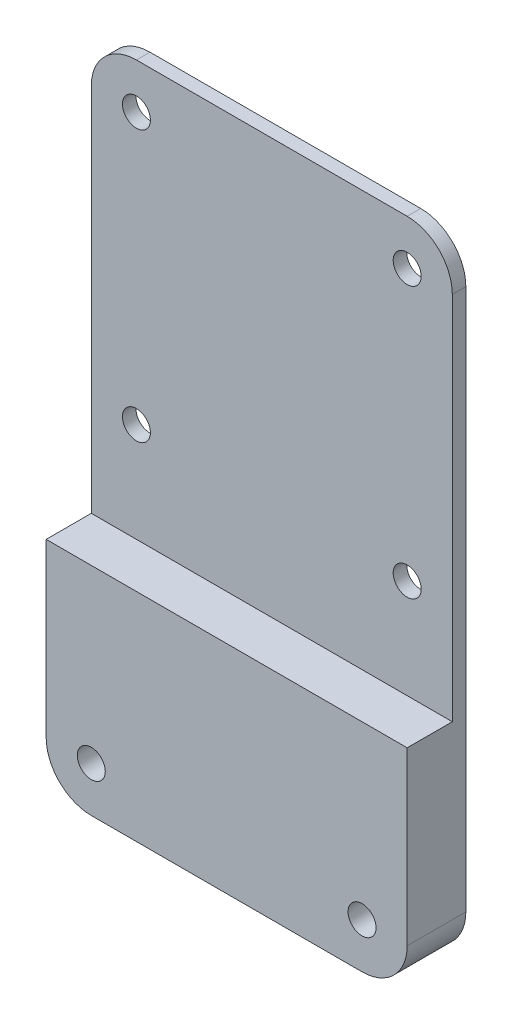
ISO-10303-21;
HEADER;
FILE_DESCRIPTION(('STEP AP214'),'2;1');
FILE_NAME('part.step','',(''),(''),'','','');
FILE_SCHEMA(('AUTOMOTIVE_DESIGN { 1 0 10303 214 1 1 1 1 }'));
ENDSEC;
DATA;
#1=APPLICATION_CONTEXT('core data for automotive mechanical design processes');
#2=APPLICATION_PROTOCOL_DEFINITION('international standard','automotive_design',2000,#1);
#3=PRODUCT_CONTEXT('',#1,'mechanical');
#4=PRODUCT('Part','Part','',(#3));
#5=PRODUCT_RELATED_PRODUCT_CATEGORY('part','',(#4));
#6=PRODUCT_DEFINITION_FORMATION('','',#4);
#7=PRODUCT_DEFINITION_CONTEXT('part definition',#1,'design');
#8=PRODUCT_DEFINITION('design','',#6,#7);
#9=PRODUCT_DEFINITION_SHAPE('','',#8);
#10=(LENGTH_UNIT() NAMED_UNIT(*) SI_UNIT(.MILLI.,.METRE.));
#11=(NAMED_UNIT(*) PLANE_ANGLE_UNIT() SI_UNIT($,.RADIAN.));
#12=(NAMED_UNIT(*) SI_UNIT($,.STERADIAN.) SOLID_ANGLE_UNIT());
#13=UNCERTAINTY_MEASURE_WITH_UNIT(LENGTH_MEASURE(1.E-05),#10,'distance_accuracy_value','');
#14=(GEOMETRIC_REPRESENTATION_CONTEXT(3) GLOBAL_UNCERTAINTY_ASSIGNED_CONTEXT((#13)) GLOBAL_UNIT_ASSIGNED_CONTEXT((#10,
#11,#12)) REPRESENTATION_CONTEXT('',''));
#15=CARTESIAN_POINT('',(0.,0.,0.));
#16=DIRECTION('',(0.,0.,1.));
#17=DIRECTION('',(1.,0.,0.));
#18=AXIS2_PLACEMENT_3D('',#15,#16,#17);
#19=CARTESIAN_POINT('',(0.,0.,1.5));
#20=DIRECTION('',(0.,0.,1.));
#21=DIRECTION('',(1.,0.,0.));
#22=AXIS2_PLACEMENT_3D('',#19,#20,#21);
#23=PLANE('',#22);
#24=DIRECTION('',(0.,1.,0.));
#25=VECTOR('',#24,1.);
#26=CARTESIAN_POINT('',(40.,0.,1.5));
#27=LINE('',#26,#25);
#28=CARTESIAN_POINT('',(40.,-46.,1.5));
#29=VERTEX_POINT('',#28);
#30=CARTESIAN_POINT('',(40.,-5.,1.5));
#31=VERTEX_POINT('',#30);
#32=EDGE_CURVE('E136',#29,#31,#27,.T.);
#33=ORIENTED_EDGE('',*,*,#32,.T.);
#34=CARTESIAN_POINT('',(35.,-5.,1.5));
#35=DIRECTION('',(0.,0.,1.));
#36=DIRECTION('',(1.,0.,0.));
#37=AXIS2_PLACEMENT_3D('',#34,#35,#36);
#38=CIRCLE('',#37,5.);
#39=CARTESIAN_POINT('',(35.,0.,1.5));
#40=VERTEX_POINT('',#39);
#41=EDGE_CURVE('E256',#31,#40,#38,.T.);
#42=ORIENTED_EDGE('',*,*,#41,.T.);
#43=DIRECTION('',(-1.,0.,0.));
#44=VECTOR('',#43,1.);
#45=CARTESIAN_POINT('',(0.,0.,1.5));
#46=LINE('',#45,#44);
#47=CARTESIAN_POINT('',(5.,0.,1.5));
#48=VERTEX_POINT('',#47);
#49=EDGE_CURVE('E210',#40,#48,#46,.T.);
#50=ORIENTED_EDGE('',*,*,#49,.T.);
#51=CARTESIAN_POINT('',(5.,-5.,1.5));
#52=DIRECTION('',(0.,0.,1.));
#53=DIRECTION('',(1.,0.,0.));
#54=AXIS2_PLACEMENT_3D('',#51,#52,#53);
#55=CIRCLE('',#54,5.);
#56=CARTESIAN_POINT('',(0.,-5.,1.5));
#57=VERTEX_POINT('',#56);
#58=EDGE_CURVE('E254',#48,#57,#55,.T.);
#59=ORIENTED_EDGE('',*,*,#58,.T.);
#60=DIRECTION('',(0.,-1.,0.));
#61=VECTOR('',#60,1.);
#62=CARTESIAN_POINT('',(0.,0.,1.5));
#63=LINE('',#62,#61);
#64=CARTESIAN_POINT('',(0.,-46.,1.5));
#65=VERTEX_POINT('',#64);
#66=EDGE_CURVE('E203',#57,#65,#63,.T.);
#67=ORIENTED_EDGE('',*,*,#66,.T.);
#68=DIRECTION('',(-1.,0.,0.));
#69=VECTOR('',#68,1.);
#70=CARTESIAN_POINT('',(0.,-46.,1.5));
#71=LINE('',#70,#69);
#72=EDGE_CURVE('E156',#29,#65,#71,.T.);
#73=ORIENTED_EDGE('',*,*,#72,.F.);
#74=EDGE_LOOP('',(#33,#42,#50,#59,#67,#73));
#75=FACE_BOUND('',#74,.T.);
#76=CARTESIAN_POINT('',(5.,-35.,1.5));
#77=DIRECTION('',(0.,0.,1.));
#78=DIRECTION('',(1.,0.,0.));
#79=AXIS2_PLACEMENT_3D('',#76,#77,#78);
#80=CIRCLE('',#79,1.55);
#81=CARTESIAN_POINT('',(6.55,-35.,1.5));
#82=VERTEX_POINT('',#81);
#83=EDGE_CURVE('E180',#82,#82,#80,.T.);
#84=ORIENTED_EDGE('',*,*,#83,.F.);
#85=EDGE_LOOP('',(#84));
#86=FACE_BOUND('',#85,.T.);
#87=CARTESIAN_POINT('',(5.,-5.,1.5));
#88=DIRECTION('',(0.,0.,1.));
#89=DIRECTION('',(1.,0.,0.));
#90=AXIS2_PLACEMENT_3D('',#87,#88,#89);
#91=CIRCLE('',#90,1.55);
#92=CARTESIAN_POINT('',(6.55,-5.,1.5));
#93=VERTEX_POINT('',#92);
#94=EDGE_CURVE('E193',#93,#93,#91,.T.);
#95=ORIENTED_EDGE('',*,*,#94,.F.);
#96=EDGE_LOOP('',(#95));
#97=FACE_BOUND('',#96,.T.);
#98=CARTESIAN_POINT('',(35.,-5.,1.5));
#99=DIRECTION('',(0.,0.,1.));
#100=DIRECTION('',(1.,0.,0.));
#101=AXIS2_PLACEMENT_3D('',#98,#99,#100);
#102=CIRCLE('',#101,1.54999999999999);
#103=CARTESIAN_POINT('',(36.55,-5.,1.5));
#104=VERTEX_POINT('',#103);
#105=EDGE_CURVE('E183',#104,#104,#102,.T.);
#106=ORIENTED_EDGE('',*,*,#105,.F.);
#107=EDGE_LOOP('',(#106));
#108=FACE_BOUND('',#107,.T.);
#109=CARTESIAN_POINT('',(35.,-35.,1.5));
#110=DIRECTION('',(0.,0.,1.));
#111=DIRECTION('',(1.,0.,0.));
#112=AXIS2_PLACEMENT_3D('',#109,#110,#111);
#113=CIRCLE('',#112,1.54999999999999);
#114=CARTESIAN_POINT('',(36.55,-35.,1.5));
#115=VERTEX_POINT('',#114);
#116=EDGE_CURVE('E166',#115,#115,#113,.T.);
#117=ORIENTED_EDGE('',*,*,#116,.F.);
#118=EDGE_LOOP('',(#117));
#119=FACE_BOUND('',#118,.T.);
#120=ADVANCED_FACE('F44',(#75,#86,#97,#108,#119),#23,.T.);
#121=CARTESIAN_POINT('',(0.,0.,0.));
#122=DIRECTION('',(0.,0.,1.));
#123=DIRECTION('',(1.,0.,0.));
#124=AXIS2_PLACEMENT_3D('',#121,#122,#123);
#125=PLANE('',#124);
#126=DIRECTION('',(-1.,0.,0.));
#127=VECTOR('',#126,1.);
#128=CARTESIAN_POINT('',(0.,0.,0.));
#129=LINE('',#128,#127);
#130=CARTESIAN_POINT('',(35.,0.,0.));
#131=VERTEX_POINT('',#130);
#132=CARTESIAN_POINT('',(5.,0.,0.));
#133=VERTEX_POINT('',#132);
#134=EDGE_CURVE('E204',#131,#133,#129,.T.);
#135=ORIENTED_EDGE('',*,*,#134,.F.);
#136=CARTESIAN_POINT('',(35.,-5.,0.));
#137=DIRECTION('',(0.,0.,1.));
#138=DIRECTION('',(1.,0.,0.));
#139=AXIS2_PLACEMENT_3D('',#136,#137,#138);
#140=CIRCLE('',#139,5.);
#141=CARTESIAN_POINT('',(40.,-5.,0.));
#142=VERTEX_POINT('',#141);
#143=EDGE_CURVE('E247',#131,#142,#140,.F.);
#144=ORIENTED_EDGE('',*,*,#143,.T.);
#145=DIRECTION('',(0.,1.,0.));
#146=VECTOR('',#145,1.);
#147=CARTESIAN_POINT('',(40.,0.,0.));
#148=LINE('',#147,#146);
#149=CARTESIAN_POINT('',(40.,-65.,0.));
#150=VERTEX_POINT('',#149);
#151=EDGE_CURVE('E217',#150,#142,#148,.T.);
#152=ORIENTED_EDGE('',*,*,#151,.F.);
#153=CARTESIAN_POINT('',(35.,-65.,0.));
#154=DIRECTION('',(0.,0.,1.));
#155=DIRECTION('',(1.,0.,0.));
#156=AXIS2_PLACEMENT_3D('',#153,#154,#155);
#157=CIRCLE('',#156,5.);
#158=CARTESIAN_POINT('',(35.,-70.,0.));
#159=VERTEX_POINT('',#158);
#160=EDGE_CURVE('E240',#150,#159,#157,.F.);
#161=ORIENTED_EDGE('',*,*,#160,.T.);
#162=DIRECTION('',(1.,0.,0.));
#163=VECTOR('',#162,1.);
#164=CARTESIAN_POINT('',(0.,-70.,0.));
#165=LINE('',#164,#163);
#166=CARTESIAN_POINT('',(5.00000000000001,-70.,0.));
#167=VERTEX_POINT('',#166);
#168=EDGE_CURVE('E214',#167,#159,#165,.T.);
#169=ORIENTED_EDGE('',*,*,#168,.F.);
#170=CARTESIAN_POINT('',(5.00000000000001,-65.,0.));
#171=DIRECTION('',(0.,0.,1.));
#172=DIRECTION('',(1.,0.,0.));
#173=AXIS2_PLACEMENT_3D('',#170,#171,#172);
#174=CIRCLE('',#173,5.);
#175=CARTESIAN_POINT('',(0.,-65.,0.));
#176=VERTEX_POINT('',#175);
#177=EDGE_CURVE('E238',#167,#176,#174,.F.);
#178=ORIENTED_EDGE('',*,*,#177,.T.);
#179=DIRECTION('',(0.,-1.,0.));
#180=VECTOR('',#179,1.);
#181=CARTESIAN_POINT('',(0.,0.,0.));
#182=LINE('',#181,#180);
#183=CARTESIAN_POINT('',(0.,-5.,0.));
#184=VERTEX_POINT('',#183);
#185=EDGE_CURVE('E197',#184,#176,#182,.T.);
#186=ORIENTED_EDGE('',*,*,#185,.F.);
#187=CARTESIAN_POINT('',(5.,-5.,0.));
#188=DIRECTION('',(0.,0.,1.));
#189=DIRECTION('',(1.,0.,0.));
#190=AXIS2_PLACEMENT_3D('',#187,#188,#189);
#191=CIRCLE('',#190,5.);
#192=EDGE_CURVE('E244',#184,#133,#191,.F.);
#193=ORIENTED_EDGE('',*,*,#192,.T.);
#194=EDGE_LOOP('',(#135,#144,#152,#161,#169,#178,#186,#193));
#195=FACE_BOUND('',#194,.T.);
#196=CARTESIAN_POINT('',(5.,-5.,0.));
#197=DIRECTION('',(0.,0.,1.));
#198=DIRECTION('',(1.,0.,0.));
#199=AXIS2_PLACEMENT_3D('',#196,#197,#198);
#200=CIRCLE('',#199,1.55);
#201=CARTESIAN_POINT('',(6.55,-5.,0.));
#202=VERTEX_POINT('',#201);
#203=EDGE_CURVE('E186',#202,#202,#200,.T.);
#204=ORIENTED_EDGE('',*,*,#203,.T.);
#205=EDGE_LOOP('',(#204));
#206=FACE_BOUND('',#205,.T.);
#207=CARTESIAN_POINT('',(35.,-5.,0.));
#208=DIRECTION('',(0.,0.,1.));
#209=DIRECTION('',(1.,0.,0.));
#210=AXIS2_PLACEMENT_3D('',#207,#208,#209);
#211=CIRCLE('',#210,1.54999999999999);
#212=CARTESIAN_POINT('',(36.55,-5.,0.));
#213=VERTEX_POINT('',#212);
#214=EDGE_CURVE('E182',#213,#213,#211,.T.);
#215=ORIENTED_EDGE('',*,*,#214,.T.);
#216=EDGE_LOOP('',(#215));
#217=FACE_BOUND('',#216,.T.);
#218=CARTESIAN_POINT('',(5.,-35.,0.));
#219=DIRECTION('',(0.,0.,1.));
#220=DIRECTION('',(1.,0.,0.));
#221=AXIS2_PLACEMENT_3D('',#218,#219,#220);
#222=CIRCLE('',#221,1.55);
#223=CARTESIAN_POINT('',(6.55,-35.,0.));
#224=VERTEX_POINT('',#223);
#225=EDGE_CURVE('E174',#224,#224,#222,.T.);
#226=ORIENTED_EDGE('',*,*,#225,.T.);
#227=EDGE_LOOP('',(#226));
#228=FACE_BOUND('',#227,.T.);
#229=CARTESIAN_POINT('',(35.,-35.,0.));
#230=DIRECTION('',(0.,0.,1.));
#231=DIRECTION('',(1.,0.,0.));
#232=AXIS2_PLACEMENT_3D('',#229,#230,#231);
#233=CIRCLE('',#232,1.54999999999999);
#234=CARTESIAN_POINT('',(36.55,-35.,0.));
#235=VERTEX_POINT('',#234);
#236=EDGE_CURVE('E169',#235,#235,#233,.T.);
#237=ORIENTED_EDGE('',*,*,#236,.T.);
#238=EDGE_LOOP('',(#237));
#239=FACE_BOUND('',#238,.T.);
#240=CARTESIAN_POINT('',(5.00000000000001,-65.,0.));
#241=DIRECTION('',(0.,0.,1.));
#242=DIRECTION('',(1.,0.,0.));
#243=AXIS2_PLACEMENT_3D('',#240,#241,#242);
#244=CIRCLE('',#243,1.55);
#245=CARTESIAN_POINT('',(6.55000000000001,-65.,0.));
#246=VERTEX_POINT('',#245);
#247=EDGE_CURVE('E163',#246,#246,#244,.T.);
#248=ORIENTED_EDGE('',*,*,#247,.T.);
#249=EDGE_LOOP('',(#248));
#250=FACE_BOUND('',#249,.T.);
#251=CARTESIAN_POINT('',(35.,-65.,0.));
#252=DIRECTION('',(0.,0.,1.));
#253=DIRECTION('',(1.,0.,0.));
#254=AXIS2_PLACEMENT_3D('',#251,#252,#253);
#255=CIRCLE('',#254,1.55);
#256=CARTESIAN_POINT('',(36.55,-65.,0.));
#257=VERTEX_POINT('',#256);
#258=EDGE_CURVE('E145',#257,#257,#255,.T.);
#259=ORIENTED_EDGE('',*,*,#258,.T.);
#260=EDGE_LOOP('',(#259));
#261=FACE_BOUND('',#260,.T.);
#262=ADVANCED_FACE('F278',(#195,#206,#217,#228,#239,#250,#261),#125,.F.);
#263=CARTESIAN_POINT('',(0.,0.,1.5));
#264=DIRECTION('',(1.,0.,0.));
#265=DIRECTION('',(0.,1.,0.));
#266=AXIS2_PLACEMENT_3D('',#263,#264,#265);
#267=PLANE('',#266);
#268=ORIENTED_EDGE('',*,*,#66,.F.);
#269=DIRECTION('',(0.,0.,-1.));
#270=VECTOR('',#269,1.);
#271=CARTESIAN_POINT('',(0.,-5.,1.5));
#272=LINE('',#271,#270);
#273=EDGE_CURVE('E262',#57,#184,#272,.T.);
#274=ORIENTED_EDGE('',*,*,#273,.T.);
#275=ORIENTED_EDGE('',*,*,#185,.T.);
#276=DIRECTION('',(0.,0.,-1.));
#277=VECTOR('',#276,1.);
#278=CARTESIAN_POINT('',(0.,-65.,1.5));
#279=LINE('',#278,#277);
#280=CARTESIAN_POINT('',(0.,-65.,6.5));
#281=VERTEX_POINT('',#280);
#282=EDGE_CURVE('E261',#176,#281,#279,.F.);
#283=ORIENTED_EDGE('',*,*,#282,.T.);
#284=DIRECTION('',(0.,-1.,0.));
#285=VECTOR('',#284,1.);
#286=CARTESIAN_POINT('',(0.,-46.,6.5));
#287=LINE('',#286,#285);
#288=CARTESIAN_POINT('',(0.,-46.,6.5));
#289=VERTEX_POINT('',#288);
#290=EDGE_CURVE('E158',#289,#281,#287,.T.);
#291=ORIENTED_EDGE('',*,*,#290,.F.);
#292=DIRECTION('',(0.,0.,-1.));
#293=VECTOR('',#292,1.);
#294=CARTESIAN_POINT('',(0.,-46.,6.5));
#295=LINE('',#294,#293);
#296=EDGE_CURVE('E144',#289,#65,#295,.T.);
#297=ORIENTED_EDGE('',*,*,#296,.T.);
#298=EDGE_LOOP('',(#268,#274,#275,#283,#291,#297));
#299=FACE_BOUND('',#298,.T.);
#300=ADVANCED_FACE('F305',(#299),#267,.F.);
#301=CARTESIAN_POINT('',(0.,-70.,1.5));
#302=DIRECTION('',(0.,1.,0.));
#303=DIRECTION('',(0.,0.,1.));
#304=AXIS2_PLACEMENT_3D('',#301,#302,#303);
#305=PLANE('',#304);
#306=DIRECTION('',(1.,0.,0.));
#307=VECTOR('',#306,1.);
#308=CARTESIAN_POINT('',(0.,-70.,6.5));
#309=LINE('',#308,#307);
#310=CARTESIAN_POINT('',(5.00000000000001,-70.,6.5));
#311=VERTEX_POINT('',#310);
#312=CARTESIAN_POINT('',(35.,-70.,6.5));
#313=VERTEX_POINT('',#312);
#314=EDGE_CURVE('E135',#311,#313,#309,.T.);
#315=ORIENTED_EDGE('',*,*,#314,.F.);
#316=DIRECTION('',(0.,0.,-1.));
#317=VECTOR('',#316,1.);
#318=CARTESIAN_POINT('',(5.00000000000001,-70.,1.5));
#319=LINE('',#318,#317);
#320=EDGE_CURVE('E269',#311,#167,#319,.T.);
#321=ORIENTED_EDGE('',*,*,#320,.T.);
#322=ORIENTED_EDGE('',*,*,#168,.T.);
#323=DIRECTION('',(0.,0.,-1.));
#324=VECTOR('',#323,1.);
#325=CARTESIAN_POINT('',(35.,-70.,1.5));
#326=LINE('',#325,#324);
#327=EDGE_CURVE('E62',#159,#313,#326,.F.);
#328=ORIENTED_EDGE('',*,*,#327,.T.);
#329=EDGE_LOOP('',(#315,#321,#322,#328));
#330=FACE_BOUND('',#329,.T.);
#331=ADVANCED_FACE('F277',(#330),#305,.F.);
#332=CARTESIAN_POINT('',(40.,0.,1.5));
#333=DIRECTION('',(-1.,0.,0.));
#334=DIRECTION('',(0.,0.,1.));
#335=AXIS2_PLACEMENT_3D('',#332,#333,#334);
#336=PLANE('',#335);
#337=ORIENTED_EDGE('',*,*,#151,.T.);
#338=DIRECTION('',(0.,0.,-1.));
#339=VECTOR('',#338,1.);
#340=CARTESIAN_POINT('',(40.,-5.,1.5));
#341=LINE('',#340,#339);
#342=EDGE_CURVE('E252',#142,#31,#341,.F.);
#343=ORIENTED_EDGE('',*,*,#342,.T.);
#344=ORIENTED_EDGE('',*,*,#32,.F.);
#345=DIRECTION('',(0.,0.,-1.));
#346=VECTOR('',#345,1.);
#347=CARTESIAN_POINT('',(40.,-46.,6.5));
#348=LINE('',#347,#346);
#349=CARTESIAN_POINT('',(40.,-46.,6.5));
#350=VERTEX_POINT('',#349);
#351=EDGE_CURVE('E137',#350,#29,#348,.T.);
#352=ORIENTED_EDGE('',*,*,#351,.F.);
#353=DIRECTION('',(0.,1.,0.));
#354=VECTOR('',#353,1.);
#355=CARTESIAN_POINT('',(40.,-46.,6.5));
#356=LINE('',#355,#354);
#357=CARTESIAN_POINT('',(40.,-65.,6.5));
#358=VERTEX_POINT('',#357);
#359=EDGE_CURVE('E122',#358,#350,#356,.T.);
#360=ORIENTED_EDGE('',*,*,#359,.F.);
#361=DIRECTION('',(0.,0.,-1.));
#362=VECTOR('',#361,1.);
#363=CARTESIAN_POINT('',(40.,-65.,1.5));
#364=LINE('',#363,#362);
#365=EDGE_CURVE('E249',#358,#150,#364,.T.);
#366=ORIENTED_EDGE('',*,*,#365,.T.);
#367=EDGE_LOOP('',(#337,#343,#344,#352,#360,#366));
#368=FACE_BOUND('',#367,.T.);
#369=ADVANCED_FACE('F138',(#368),#336,.F.);
#370=CARTESIAN_POINT('',(0.,0.,1.5));
#371=DIRECTION('',(0.,-1.,0.));
#372=DIRECTION('',(0.,0.,-1.));
#373=AXIS2_PLACEMENT_3D('',#370,#371,#372);
#374=PLANE('',#373);
#375=ORIENTED_EDGE('',*,*,#49,.F.);
#376=DIRECTION('',(0.,0.,-1.));
#377=VECTOR('',#376,1.);
#378=CARTESIAN_POINT('',(35.,0.,1.5));
#379=LINE('',#378,#377);
#380=EDGE_CURVE('E233',#40,#131,#379,.T.);
#381=ORIENTED_EDGE('',*,*,#380,.T.);
#382=ORIENTED_EDGE('',*,*,#134,.T.);
#383=DIRECTION('',(0.,0.,-1.));
#384=VECTOR('',#383,1.);
#385=CARTESIAN_POINT('',(5.,0.,1.5));
#386=LINE('',#385,#384);
#387=EDGE_CURVE('E211',#133,#48,#386,.F.);
#388=ORIENTED_EDGE('',*,*,#387,.T.);
#389=EDGE_LOOP('',(#375,#381,#382,#388));
#390=FACE_BOUND('',#389,.T.);
#391=ADVANCED_FACE('F293',(#390),#374,.F.);
#392=CARTESIAN_POINT('',(5.,-5.,1.5));
#393=DIRECTION('',(0.,0.,-1.));
#394=DIRECTION('',(-1.,0.,0.));
#395=AXIS2_PLACEMENT_3D('',#392,#393,#394);
#396=CYLINDRICAL_SURFACE('',#395,1.55);
#397=ORIENTED_EDGE('',*,*,#94,.T.);
#398=EDGE_LOOP('',(#397));
#399=FACE_BOUND('',#398,.T.);
#400=ORIENTED_EDGE('',*,*,#203,.F.);
#401=EDGE_LOOP('',(#400));
#402=FACE_BOUND('',#401,.T.);
#403=ADVANCED_FACE('F325',(#399,#402),#396,.F.);
#404=CARTESIAN_POINT('',(35.,-5.,1.5));
#405=DIRECTION('',(0.,0.,-1.));
#406=DIRECTION('',(-1.,0.,0.));
#407=AXIS2_PLACEMENT_3D('',#404,#405,#406);
#408=CYLINDRICAL_SURFACE('',#407,1.54999999999999);
#409=ORIENTED_EDGE('',*,*,#105,.T.);
#410=EDGE_LOOP('',(#409));
#411=FACE_BOUND('',#410,.T.);
#412=ORIENTED_EDGE('',*,*,#214,.F.);
#413=EDGE_LOOP('',(#412));
#414=FACE_BOUND('',#413,.T.);
#415=ADVANCED_FACE('F360',(#411,#414),#408,.F.);
#416=CARTESIAN_POINT('',(5.,-35.,1.5));
#417=DIRECTION('',(0.,0.,-1.));
#418=DIRECTION('',(-1.,0.,0.));
#419=AXIS2_PLACEMENT_3D('',#416,#417,#418);
#420=CYLINDRICAL_SURFACE('',#419,1.55);
#421=ORIENTED_EDGE('',*,*,#83,.T.);
#422=EDGE_LOOP('',(#421));
#423=FACE_BOUND('',#422,.T.);
#424=ORIENTED_EDGE('',*,*,#225,.F.);
#425=EDGE_LOOP('',(#424));
#426=FACE_BOUND('',#425,.T.);
#427=ADVANCED_FACE('F351',(#423,#426),#420,.F.);
#428=CARTESIAN_POINT('',(35.,-35.,1.5));
#429=DIRECTION('',(0.,0.,-1.));
#430=DIRECTION('',(-1.,0.,0.));
#431=AXIS2_PLACEMENT_3D('',#428,#429,#430);
#432=CYLINDRICAL_SURFACE('',#431,1.54999999999999);
#433=ORIENTED_EDGE('',*,*,#116,.T.);
#434=EDGE_LOOP('',(#433));
#435=FACE_BOUND('',#434,.T.);
#436=ORIENTED_EDGE('',*,*,#236,.F.);
#437=EDGE_LOOP('',(#436));
#438=FACE_BOUND('',#437,.T.);
#439=ADVANCED_FACE('F352',(#435,#438),#432,.F.);
#440=CARTESIAN_POINT('',(5.00000000000001,-65.,1.5));
#441=DIRECTION('',(0.,0.,-1.));
#442=DIRECTION('',(-1.,0.,0.));
#443=AXIS2_PLACEMENT_3D('',#440,#441,#442);
#444=CYLINDRICAL_SURFACE('',#443,1.55);
#445=ORIENTED_EDGE('',*,*,#247,.F.);
#446=EDGE_LOOP('',(#445));
#447=FACE_BOUND('',#446,.T.);
#448=CARTESIAN_POINT('',(5.00000000000001,-65.,6.5));
#449=DIRECTION('',(0.,0.,1.));
#450=DIRECTION('',(1.,0.,0.));
#451=AXIS2_PLACEMENT_3D('',#448,#449,#450);
#452=CIRCLE('',#451,1.55);
#453=CARTESIAN_POINT('',(6.55000000000001,-65.,6.5));
#454=VERTEX_POINT('',#453);
#455=EDGE_CURVE('E221',#454,#454,#452,.T.);
#456=ORIENTED_EDGE('',*,*,#455,.T.);
#457=EDGE_LOOP('',(#456));
#458=FACE_BOUND('',#457,.T.);
#459=ADVANCED_FACE('F346',(#447,#458),#444,.F.);
#460=CARTESIAN_POINT('',(35.,-65.,1.5));
#461=DIRECTION('',(0.,0.,-1.));
#462=DIRECTION('',(-1.,0.,0.));
#463=AXIS2_PLACEMENT_3D('',#460,#461,#462);
#464=CYLINDRICAL_SURFACE('',#463,1.55);
#465=ORIENTED_EDGE('',*,*,#258,.F.);
#466=EDGE_LOOP('',(#465));
#467=FACE_BOUND('',#466,.T.);
#468=CARTESIAN_POINT('',(35.,-65.,6.5));
#469=DIRECTION('',(0.,0.,1.));
#470=DIRECTION('',(1.,0.,0.));
#471=AXIS2_PLACEMENT_3D('',#468,#469,#470);
#472=CIRCLE('',#471,1.54999999999999);
#473=CARTESIAN_POINT('',(36.55,-65.,6.5));
#474=VERTEX_POINT('',#473);
#475=EDGE_CURVE('E157',#474,#474,#472,.T.);
#476=ORIENTED_EDGE('',*,*,#475,.T.);
#477=EDGE_LOOP('',(#476));
#478=FACE_BOUND('',#477,.T.);
#479=ADVANCED_FACE('F343',(#467,#478),#464,.F.);
#480=CARTESIAN_POINT('',(0.,0.,6.5));
#481=DIRECTION('',(0.,0.,1.));
#482=DIRECTION('',(1.,0.,0.));
#483=AXIS2_PLACEMENT_3D('',#480,#481,#482);
#484=PLANE('',#483);
#485=ORIENTED_EDGE('',*,*,#475,.F.);
#486=EDGE_LOOP('',(#485));
#487=FACE_BOUND('',#486,.T.);
#488=ORIENTED_EDGE('',*,*,#455,.F.);
#489=EDGE_LOOP('',(#488));
#490=FACE_BOUND('',#489,.T.);
#491=ORIENTED_EDGE('',*,*,#290,.T.);
#492=CARTESIAN_POINT('',(5.00000000000001,-65.,6.5));
#493=DIRECTION('',(0.,0.,1.));
#494=DIRECTION('',(1.,0.,0.));
#495=AXIS2_PLACEMENT_3D('',#492,#493,#494);
#496=CIRCLE('',#495,5.);
#497=EDGE_CURVE('E11',#281,#311,#496,.T.);
#498=ORIENTED_EDGE('',*,*,#497,.T.);
#499=ORIENTED_EDGE('',*,*,#314,.T.);
#500=CARTESIAN_POINT('',(35.,-65.,6.5));
#501=DIRECTION('',(0.,0.,1.));
#502=DIRECTION('',(1.,0.,0.));
#503=AXIS2_PLACEMENT_3D('',#500,#501,#502);
#504=CIRCLE('',#503,5.);
#505=EDGE_CURVE('E53',#313,#358,#504,.T.);
#506=ORIENTED_EDGE('',*,*,#505,.T.);
#507=ORIENTED_EDGE('',*,*,#359,.T.);
#508=DIRECTION('',(-1.,0.,0.));
#509=VECTOR('',#508,1.);
#510=CARTESIAN_POINT('',(0.,-46.,6.5));
#511=LINE('',#510,#509);
#512=EDGE_CURVE('E121',#350,#289,#511,.T.);
#513=ORIENTED_EDGE('',*,*,#512,.T.);
#514=EDGE_LOOP('',(#491,#498,#499,#506,#507,#513));
#515=FACE_BOUND('',#514,.T.);
#516=ADVANCED_FACE('F123',(#487,#490,#515),#484,.T.);
#517=CARTESIAN_POINT('',(0.,-46.,6.5));
#518=DIRECTION('',(0.,-1.,0.));
#519=DIRECTION('',(0.,0.,-1.));
#520=AXIS2_PLACEMENT_3D('',#517,#518,#519);
#521=PLANE('',#520);
#522=ORIENTED_EDGE('',*,*,#72,.T.);
#523=ORIENTED_EDGE('',*,*,#296,.F.);
#524=ORIENTED_EDGE('',*,*,#512,.F.);
#525=ORIENTED_EDGE('',*,*,#351,.T.);
#526=EDGE_LOOP('',(#522,#523,#524,#525));
#527=FACE_BOUND('',#526,.T.);
#528=ADVANCED_FACE('F150',(#527),#521,.F.);
#529=CARTESIAN_POINT('',(35.,-5.,1.5));
#530=DIRECTION('',(0.,0.,-1.));
#531=DIRECTION('',(-1.,0.,0.));
#532=AXIS2_PLACEMENT_3D('',#529,#530,#531);
#533=CYLINDRICAL_SURFACE('',#532,5.);
#534=ORIENTED_EDGE('',*,*,#41,.F.);
#535=ORIENTED_EDGE('',*,*,#342,.F.);
#536=ORIENTED_EDGE('',*,*,#143,.F.);
#537=ORIENTED_EDGE('',*,*,#380,.F.);
#538=EDGE_LOOP('',(#534,#535,#536,#537));
#539=FACE_BOUND('',#538,.T.);
#540=ADVANCED_FACE('F288',(#539),#533,.T.);
#541=CARTESIAN_POINT('',(5.,-5.,1.5));
#542=DIRECTION('',(0.,0.,-1.));
#543=DIRECTION('',(-1.,0.,0.));
#544=AXIS2_PLACEMENT_3D('',#541,#542,#543);
#545=CYLINDRICAL_SURFACE('',#544,5.);
#546=ORIENTED_EDGE('',*,*,#58,.F.);
#547=ORIENTED_EDGE('',*,*,#387,.F.);
#548=ORIENTED_EDGE('',*,*,#192,.F.);
#549=ORIENTED_EDGE('',*,*,#273,.F.);
#550=EDGE_LOOP('',(#546,#547,#548,#549));
#551=FACE_BOUND('',#550,.T.);
#552=ADVANCED_FACE('F299',(#551),#545,.T.);
#553=CARTESIAN_POINT('',(5.00000000000001,-65.,1.5));
#554=DIRECTION('',(0.,0.,-1.));
#555=DIRECTION('',(-1.,0.,0.));
#556=AXIS2_PLACEMENT_3D('',#553,#554,#555);
#557=CYLINDRICAL_SURFACE('',#556,5.);
#558=ORIENTED_EDGE('',*,*,#497,.F.);
#559=ORIENTED_EDGE('',*,*,#282,.F.);
#560=ORIENTED_EDGE('',*,*,#177,.F.);
#561=ORIENTED_EDGE('',*,*,#320,.F.);
#562=EDGE_LOOP('',(#558,#559,#560,#561));
#563=FACE_BOUND('',#562,.T.);
#564=ADVANCED_FACE('F307',(#563),#557,.T.);
#565=CARTESIAN_POINT('',(35.,-65.,1.5));
#566=DIRECTION('',(0.,0.,-1.));
#567=DIRECTION('',(-1.,0.,0.));
#568=AXIS2_PLACEMENT_3D('',#565,#566,#567);
#569=CYLINDRICAL_SURFACE('',#568,5.);
#570=ORIENTED_EDGE('',*,*,#505,.F.);
#571=ORIENTED_EDGE('',*,*,#327,.F.);
#572=ORIENTED_EDGE('',*,*,#160,.F.);
#573=ORIENTED_EDGE('',*,*,#365,.F.);
#574=EDGE_LOOP('',(#570,#571,#572,#573));
#575=FACE_BOUND('',#574,.T.);
#576=ADVANCED_FACE('F50',(#575),#569,.T.);
#577=CLOSED_SHELL('',(#120,#262,#300,#331,#369,#391,#403,#415,#427,#439,#459,#479,#516,#528,
#540,#552,#564,#576));
#578=MANIFOLD_SOLID_BREP('B2',#577);
#579=ADVANCED_BREP_SHAPE_REPRESENTATION('',(#18,#578),#14);
#580=SHAPE_DEFINITION_REPRESENTATION(#9,#579);
ENDSEC;
END-ISO-10303-21;
